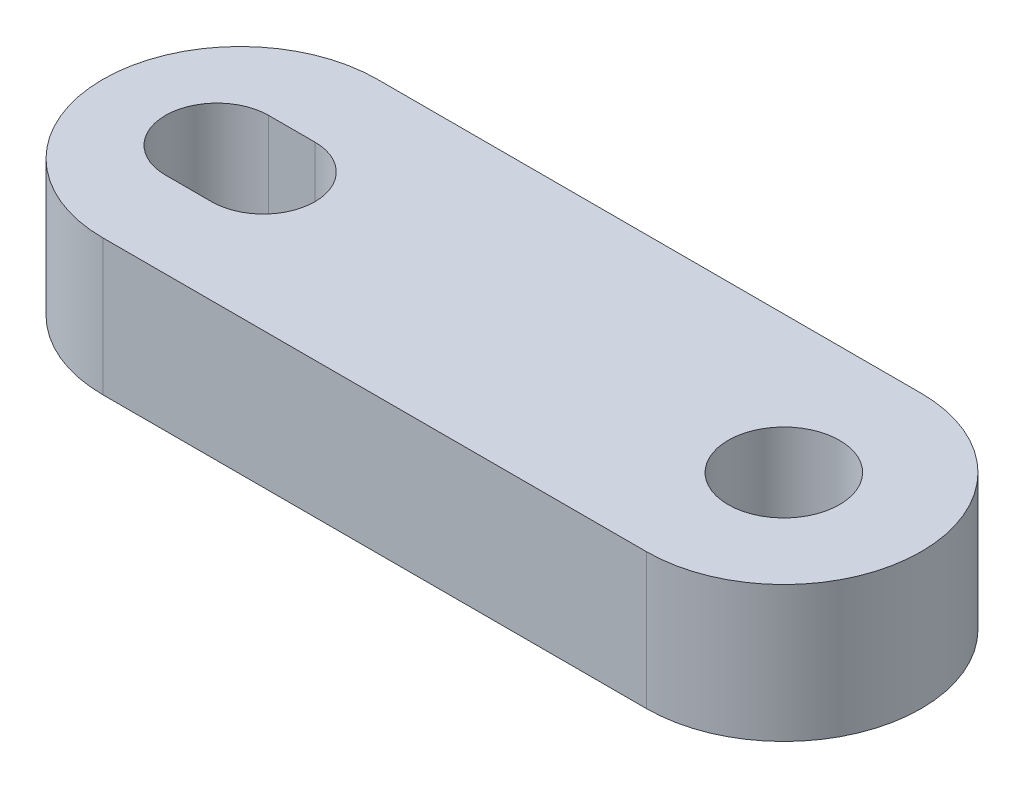
ISO-10303-21;
HEADER;
FILE_DESCRIPTION(('STEP AP214'),'2;1');
FILE_NAME('part.step','',(''),(''),'','','');
FILE_SCHEMA(('AUTOMOTIVE_DESIGN { 1 0 10303 214 1 1 1 1 }'));
ENDSEC;
DATA;
#1=APPLICATION_CONTEXT('core data for automotive mechanical design processes');
#2=APPLICATION_PROTOCOL_DEFINITION('international standard','automotive_design',2000,#1);
#3=PRODUCT_CONTEXT('',#1,'mechanical');
#4=PRODUCT('Part','Part','',(#3));
#5=PRODUCT_RELATED_PRODUCT_CATEGORY('part','',(#4));
#6=PRODUCT_DEFINITION_FORMATION('','',#4);
#7=PRODUCT_DEFINITION_CONTEXT('part definition',#1,'design');
#8=PRODUCT_DEFINITION('design','',#6,#7);
#9=PRODUCT_DEFINITION_SHAPE('','',#8);
#10=(LENGTH_UNIT() NAMED_UNIT(*) SI_UNIT(.MILLI.,.METRE.));
#11=(NAMED_UNIT(*) PLANE_ANGLE_UNIT() SI_UNIT($,.RADIAN.));
#12=(NAMED_UNIT(*) SI_UNIT($,.STERADIAN.) SOLID_ANGLE_UNIT());
#13=UNCERTAINTY_MEASURE_WITH_UNIT(LENGTH_MEASURE(1.E-05),#10,'distance_accuracy_value','');
#14=(GEOMETRIC_REPRESENTATION_CONTEXT(3) GLOBAL_UNCERTAINTY_ASSIGNED_CONTEXT((#13)) GLOBAL_UNIT_ASSIGNED_CONTEXT((#10,
#11,#12)) REPRESENTATION_CONTEXT('',''));
#15=CARTESIAN_POINT('',(0.,0.,0.));
#16=DIRECTION('',(0.,0.,1.));
#17=DIRECTION('',(1.,0.,0.));
#18=AXIS2_PLACEMENT_3D('',#15,#16,#17);
#19=CARTESIAN_POINT('',(-10.,5.,0.));
#20=DIRECTION('',(0.,1.,0.));
#21=DIRECTION('',(0.,0.,1.));
#22=AXIS2_PLACEMENT_3D('',#19,#20,#21);
#23=PLANE('',#22);
#24=CARTESIAN_POINT('',(-10.,5.,0.));
#25=DIRECTION('',(0.,1.,0.));
#26=DIRECTION('',(0.,0.,1.));
#27=AXIS2_PLACEMENT_3D('',#24,#25,#26);
#28=CIRCLE('',#27,5.05);
#29=CARTESIAN_POINT('',(-10.,5.,-5.05));
#30=VERTEX_POINT('',#29);
#31=CARTESIAN_POINT('',(-10.,5.,5.05));
#32=VERTEX_POINT('',#31);
#33=EDGE_CURVE('E139',#30,#32,#28,.T.);
#34=ORIENTED_EDGE('',*,*,#33,.T.);
#35=DIRECTION('',(1.,0.,0.));
#36=VECTOR('',#35,1.);
#37=CARTESIAN_POINT('',(-10.,5.,5.05));
#38=LINE('',#37,#36);
#39=CARTESIAN_POINT('',(10.,5.,5.05));
#40=VERTEX_POINT('',#39);
#41=EDGE_CURVE('E142',#32,#40,#38,.T.);
#42=ORIENTED_EDGE('',*,*,#41,.T.);
#43=CARTESIAN_POINT('',(10.,5.,0.));
#44=DIRECTION('',(0.,1.,0.));
#45=DIRECTION('',(0.,0.,1.));
#46=AXIS2_PLACEMENT_3D('',#43,#44,#45);
#47=CIRCLE('',#46,5.05);
#48=CARTESIAN_POINT('',(10.,5.,-5.05000000000001));
#49=VERTEX_POINT('',#48);
#50=EDGE_CURVE('E145',#40,#49,#47,.T.);
#51=ORIENTED_EDGE('',*,*,#50,.T.);
#52=DIRECTION('',(-1.,0.,0.));
#53=VECTOR('',#52,1.);
#54=CARTESIAN_POINT('',(-10.,5.,-5.05));
#55=LINE('',#54,#53);
#56=EDGE_CURVE('E147',#49,#30,#55,.T.);
#57=ORIENTED_EDGE('',*,*,#56,.T.);
#58=EDGE_LOOP('',(#34,#42,#51,#57));
#59=FACE_BOUND('',#58,.T.);
#60=CARTESIAN_POINT('',(10.,5.,0.));
#61=DIRECTION('',(0.,1.,0.));
#62=DIRECTION('',(0.,0.,1.));
#63=AXIS2_PLACEMENT_3D('',#60,#61,#62);
#64=CIRCLE('',#63,2.05);
#65=CARTESIAN_POINT('',(10.,5.,2.05));
#66=VERTEX_POINT('',#65);
#67=EDGE_CURVE('E133',#66,#66,#64,.T.);
#68=ORIENTED_EDGE('',*,*,#67,.F.);
#69=EDGE_LOOP('',(#68));
#70=FACE_BOUND('',#69,.T.);
#71=DIRECTION('',(1.,0.,0.));
#72=VECTOR('',#71,1.);
#73=CARTESIAN_POINT('',(-10.85,5.,1.9));
#74=LINE('',#73,#72);
#75=CARTESIAN_POINT('',(-10.85,5.,1.9));
#76=VERTEX_POINT('',#75);
#77=CARTESIAN_POINT('',(-9.15,5.,1.9));
#78=VERTEX_POINT('',#77);
#79=EDGE_CURVE('E105',#76,#78,#74,.T.);
#80=ORIENTED_EDGE('',*,*,#79,.F.);
#81=CARTESIAN_POINT('',(-10.85,5.,0.));
#82=DIRECTION('',(0.,1.,0.));
#83=DIRECTION('',(0.,0.,1.));
#84=AXIS2_PLACEMENT_3D('',#81,#82,#83);
#85=CIRCLE('',#84,1.9);
#86=CARTESIAN_POINT('',(-10.85,5.,-1.9));
#87=VERTEX_POINT('',#86);
#88=EDGE_CURVE('E97',#87,#76,#85,.T.);
#89=ORIENTED_EDGE('',*,*,#88,.F.);
#90=DIRECTION('',(-1.,0.,0.));
#91=VECTOR('',#90,1.);
#92=CARTESIAN_POINT('',(-10.85,5.,-1.9));
#93=LINE('',#92,#91);
#94=CARTESIAN_POINT('',(-9.15,5.,-1.9));
#95=VERTEX_POINT('',#94);
#96=EDGE_CURVE('E119',#95,#87,#93,.T.);
#97=ORIENTED_EDGE('',*,*,#96,.F.);
#98=CARTESIAN_POINT('',(-9.15,5.,0.));
#99=DIRECTION('',(0.,1.,0.));
#100=DIRECTION('',(0.,0.,1.));
#101=AXIS2_PLACEMENT_3D('',#98,#99,#100);
#102=CIRCLE('',#101,1.9);
#103=EDGE_CURVE('E117',#78,#95,#102,.T.);
#104=ORIENTED_EDGE('',*,*,#103,.F.);
#105=EDGE_LOOP('',(#80,#89,#97,#104));
#106=FACE_BOUND('',#105,.T.);
#107=ADVANCED_FACE('F32',(#59,#70,#106),#23,.T.);
#108=CARTESIAN_POINT('',(-10.,0.,0.));
#109=DIRECTION('',(0.,1.,0.));
#110=DIRECTION('',(0.,0.,1.));
#111=AXIS2_PLACEMENT_3D('',#108,#109,#110);
#112=PLANE('',#111);
#113=CARTESIAN_POINT('',(10.,0.,0.));
#114=DIRECTION('',(0.,1.,0.));
#115=DIRECTION('',(0.,0.,1.));
#116=AXIS2_PLACEMENT_3D('',#113,#114,#115);
#117=CIRCLE('',#116,2.05);
#118=CARTESIAN_POINT('',(10.,0.,2.05));
#119=VERTEX_POINT('',#118);
#120=EDGE_CURVE('E113',#119,#119,#117,.T.);
#121=ORIENTED_EDGE('',*,*,#120,.T.);
#122=EDGE_LOOP('',(#121));
#123=FACE_BOUND('',#122,.T.);
#124=CARTESIAN_POINT('',(-10.,0.,0.));
#125=DIRECTION('',(0.,1.,0.));
#126=DIRECTION('',(0.,0.,1.));
#127=AXIS2_PLACEMENT_3D('',#124,#125,#126);
#128=CIRCLE('',#127,5.05);
#129=CARTESIAN_POINT('',(-10.,0.,-5.05));
#130=VERTEX_POINT('',#129);
#131=CARTESIAN_POINT('',(-10.,0.,5.05));
#132=VERTEX_POINT('',#131);
#133=EDGE_CURVE('E136',#130,#132,#128,.T.);
#134=ORIENTED_EDGE('',*,*,#133,.F.);
#135=DIRECTION('',(-1.,0.,0.));
#136=VECTOR('',#135,1.);
#137=CARTESIAN_POINT('',(-10.,0.,-5.05));
#138=LINE('',#137,#136);
#139=CARTESIAN_POINT('',(10.,0.,-5.05000000000001));
#140=VERTEX_POINT('',#139);
#141=EDGE_CURVE('E143',#140,#130,#138,.T.);
#142=ORIENTED_EDGE('',*,*,#141,.F.);
#143=CARTESIAN_POINT('',(10.,0.,0.));
#144=DIRECTION('',(0.,1.,0.));
#145=DIRECTION('',(0.,0.,1.));
#146=AXIS2_PLACEMENT_3D('',#143,#144,#145);
#147=CIRCLE('',#146,5.05);
#148=CARTESIAN_POINT('',(10.,0.,5.05));
#149=VERTEX_POINT('',#148);
#150=EDGE_CURVE('E154',#149,#140,#147,.T.);
#151=ORIENTED_EDGE('',*,*,#150,.F.);
#152=DIRECTION('',(1.,0.,0.));
#153=VECTOR('',#152,1.);
#154=CARTESIAN_POINT('',(-10.,0.,5.05));
#155=LINE('',#154,#153);
#156=EDGE_CURVE('E152',#132,#149,#155,.T.);
#157=ORIENTED_EDGE('',*,*,#156,.F.);
#158=EDGE_LOOP('',(#134,#142,#151,#157));
#159=FACE_BOUND('',#158,.T.);
#160=CARTESIAN_POINT('',(-10.85,0.,0.));
#161=DIRECTION('',(0.,1.,0.));
#162=DIRECTION('',(0.,0.,1.));
#163=AXIS2_PLACEMENT_3D('',#160,#161,#162);
#164=CIRCLE('',#163,1.9);
#165=CARTESIAN_POINT('',(-10.85,0.,-1.9));
#166=VERTEX_POINT('',#165);
#167=CARTESIAN_POINT('',(-10.85,0.,1.9));
#168=VERTEX_POINT('',#167);
#169=EDGE_CURVE('E55',#166,#168,#164,.T.);
#170=ORIENTED_EDGE('',*,*,#169,.T.);
#171=DIRECTION('',(1.,0.,0.));
#172=VECTOR('',#171,1.);
#173=CARTESIAN_POINT('',(-10.85,0.,1.9));
#174=LINE('',#173,#172);
#175=CARTESIAN_POINT('',(-9.15,0.,1.9));
#176=VERTEX_POINT('',#175);
#177=EDGE_CURVE('E112',#168,#176,#174,.T.);
#178=ORIENTED_EDGE('',*,*,#177,.T.);
#179=CARTESIAN_POINT('',(-9.15,0.,0.));
#180=DIRECTION('',(0.,1.,0.));
#181=DIRECTION('',(0.,0.,1.));
#182=AXIS2_PLACEMENT_3D('',#179,#180,#181);
#183=CIRCLE('',#182,1.9);
#184=CARTESIAN_POINT('',(-9.15,0.,-1.9));
#185=VERTEX_POINT('',#184);
#186=EDGE_CURVE('E125',#176,#185,#183,.T.);
#187=ORIENTED_EDGE('',*,*,#186,.T.);
#188=DIRECTION('',(-1.,0.,0.));
#189=VECTOR('',#188,1.);
#190=CARTESIAN_POINT('',(-10.85,0.,-1.9));
#191=LINE('',#190,#189);
#192=EDGE_CURVE('E106',#185,#166,#191,.T.);
#193=ORIENTED_EDGE('',*,*,#192,.T.);
#194=EDGE_LOOP('',(#170,#178,#187,#193));
#195=FACE_BOUND('',#194,.T.);
#196=ADVANCED_FACE('F172',(#123,#159,#195),#112,.F.);
#197=CARTESIAN_POINT('',(-10.,5.,0.));
#198=DIRECTION('',(0.,-1.,0.));
#199=DIRECTION('',(0.,0.,-1.));
#200=AXIS2_PLACEMENT_3D('',#197,#198,#199);
#201=CYLINDRICAL_SURFACE('',#200,5.05);
#202=ORIENTED_EDGE('',*,*,#133,.T.);
#203=DIRECTION('',(0.,-1.,0.));
#204=VECTOR('',#203,1.);
#205=CARTESIAN_POINT('',(-10.,5.,5.05));
#206=LINE('',#205,#204);
#207=EDGE_CURVE('E11',#32,#132,#206,.T.);
#208=ORIENTED_EDGE('',*,*,#207,.F.);
#209=ORIENTED_EDGE('',*,*,#33,.F.);
#210=DIRECTION('',(0.,-1.,0.));
#211=VECTOR('',#210,1.);
#212=CARTESIAN_POINT('',(-10.,5.,-5.05));
#213=LINE('',#212,#211);
#214=EDGE_CURVE('E149',#30,#130,#213,.T.);
#215=ORIENTED_EDGE('',*,*,#214,.T.);
#216=EDGE_LOOP('',(#202,#208,#209,#215));
#217=FACE_BOUND('',#216,.T.);
#218=ADVANCED_FACE('F34',(#217),#201,.T.);
#219=CARTESIAN_POINT('',(-10.,5.,5.05));
#220=DIRECTION('',(0.,0.,-1.));
#221=DIRECTION('',(-1.,0.,0.));
#222=AXIS2_PLACEMENT_3D('',#219,#220,#221);
#223=PLANE('',#222);
#224=ORIENTED_EDGE('',*,*,#156,.T.);
#225=DIRECTION('',(0.,-1.,0.));
#226=VECTOR('',#225,1.);
#227=CARTESIAN_POINT('',(10.,5.,5.05));
#228=LINE('',#227,#226);
#229=EDGE_CURVE('E40',#40,#149,#228,.T.);
#230=ORIENTED_EDGE('',*,*,#229,.F.);
#231=ORIENTED_EDGE('',*,*,#41,.F.);
#232=ORIENTED_EDGE('',*,*,#207,.T.);
#233=EDGE_LOOP('',(#224,#230,#231,#232));
#234=FACE_BOUND('',#233,.T.);
#235=ADVANCED_FACE('F183',(#234),#223,.F.);
#236=CARTESIAN_POINT('',(10.,5.,0.));
#237=DIRECTION('',(0.,-1.,0.));
#238=DIRECTION('',(0.,0.,-1.));
#239=AXIS2_PLACEMENT_3D('',#236,#237,#238);
#240=CYLINDRICAL_SURFACE('',#239,5.05);
#241=ORIENTED_EDGE('',*,*,#150,.T.);
#242=DIRECTION('',(0.,-1.,0.));
#243=VECTOR('',#242,1.);
#244=CARTESIAN_POINT('',(10.,5.,-5.05000000000001));
#245=LINE('',#244,#243);
#246=EDGE_CURVE('E159',#49,#140,#245,.T.);
#247=ORIENTED_EDGE('',*,*,#246,.F.);
#248=ORIENTED_EDGE('',*,*,#50,.F.);
#249=ORIENTED_EDGE('',*,*,#229,.T.);
#250=EDGE_LOOP('',(#241,#247,#248,#249));
#251=FACE_BOUND('',#250,.T.);
#252=ADVANCED_FACE('F166',(#251),#240,.T.);
#253=CARTESIAN_POINT('',(-10.,5.,-5.05));
#254=DIRECTION('',(0.,0.,1.));
#255=DIRECTION('',(1.,0.,0.));
#256=AXIS2_PLACEMENT_3D('',#253,#254,#255);
#257=PLANE('',#256);
#258=ORIENTED_EDGE('',*,*,#141,.T.);
#259=ORIENTED_EDGE('',*,*,#214,.F.);
#260=ORIENTED_EDGE('',*,*,#56,.F.);
#261=ORIENTED_EDGE('',*,*,#246,.T.);
#262=EDGE_LOOP('',(#258,#259,#260,#261));
#263=FACE_BOUND('',#262,.T.);
#264=ADVANCED_FACE('F176',(#263),#257,.F.);
#265=CARTESIAN_POINT('',(10.,5.,0.));
#266=DIRECTION('',(0.,-1.,0.));
#267=DIRECTION('',(0.,0.,-1.));
#268=AXIS2_PLACEMENT_3D('',#265,#266,#267);
#269=CYLINDRICAL_SURFACE('',#268,2.05);
#270=ORIENTED_EDGE('',*,*,#67,.T.);
#271=EDGE_LOOP('',(#270));
#272=FACE_BOUND('',#271,.T.);
#273=ORIENTED_EDGE('',*,*,#120,.F.);
#274=EDGE_LOOP('',(#273));
#275=FACE_BOUND('',#274,.T.);
#276=ADVANCED_FACE('F198',(#272,#275),#269,.F.);
#277=CARTESIAN_POINT('',(-10.85,5.,0.));
#278=DIRECTION('',(0.,-1.,0.));
#279=DIRECTION('',(0.,0.,-1.));
#280=AXIS2_PLACEMENT_3D('',#277,#278,#279);
#281=CYLINDRICAL_SURFACE('',#280,1.9);
#282=ORIENTED_EDGE('',*,*,#169,.F.);
#283=DIRECTION('',(0.,-1.,0.));
#284=VECTOR('',#283,1.);
#285=CARTESIAN_POINT('',(-10.85,5.,-1.9));
#286=LINE('',#285,#284);
#287=EDGE_CURVE('E101',#87,#166,#286,.T.);
#288=ORIENTED_EDGE('',*,*,#287,.F.);
#289=ORIENTED_EDGE('',*,*,#88,.T.);
#290=DIRECTION('',(0.,-1.,0.));
#291=VECTOR('',#290,1.);
#292=CARTESIAN_POINT('',(-10.85,5.,1.9));
#293=LINE('',#292,#291);
#294=EDGE_CURVE('E100',#76,#168,#293,.T.);
#295=ORIENTED_EDGE('',*,*,#294,.T.);
#296=EDGE_LOOP('',(#282,#288,#289,#295));
#297=FACE_BOUND('',#296,.T.);
#298=ADVANCED_FACE('F99',(#297),#281,.F.);
#299=CARTESIAN_POINT('',(-10.85,5.,1.9));
#300=DIRECTION('',(0.,0.,-1.));
#301=DIRECTION('',(-1.,0.,0.));
#302=AXIS2_PLACEMENT_3D('',#299,#300,#301);
#303=PLANE('',#302);
#304=ORIENTED_EDGE('',*,*,#177,.F.);
#305=ORIENTED_EDGE('',*,*,#294,.F.);
#306=ORIENTED_EDGE('',*,*,#79,.T.);
#307=DIRECTION('',(0.,-1.,0.));
#308=VECTOR('',#307,1.);
#309=CARTESIAN_POINT('',(-9.15,5.,1.9));
#310=LINE('',#309,#308);
#311=EDGE_CURVE('E114',#78,#176,#310,.T.);
#312=ORIENTED_EDGE('',*,*,#311,.T.);
#313=EDGE_LOOP('',(#304,#305,#306,#312));
#314=FACE_BOUND('',#313,.T.);
#315=ADVANCED_FACE('F109',(#314),#303,.T.);
#316=CARTESIAN_POINT('',(-9.15,5.,0.));
#317=DIRECTION('',(0.,-1.,0.));
#318=DIRECTION('',(0.,0.,-1.));
#319=AXIS2_PLACEMENT_3D('',#316,#317,#318);
#320=CYLINDRICAL_SURFACE('',#319,1.9);
#321=ORIENTED_EDGE('',*,*,#186,.F.);
#322=ORIENTED_EDGE('',*,*,#311,.F.);
#323=ORIENTED_EDGE('',*,*,#103,.T.);
#324=DIRECTION('',(0.,-1.,0.));
#325=VECTOR('',#324,1.);
#326=CARTESIAN_POINT('',(-9.15,5.,-1.9));
#327=LINE('',#326,#325);
#328=EDGE_CURVE('E47',#95,#185,#327,.T.);
#329=ORIENTED_EDGE('',*,*,#328,.T.);
#330=EDGE_LOOP('',(#321,#322,#323,#329));
#331=FACE_BOUND('',#330,.T.);
#332=ADVANCED_FACE('F215',(#331),#320,.F.);
#333=CARTESIAN_POINT('',(-10.85,5.,-1.9));
#334=DIRECTION('',(0.,0.,1.));
#335=DIRECTION('',(1.,0.,0.));
#336=AXIS2_PLACEMENT_3D('',#333,#334,#335);
#337=PLANE('',#336);
#338=ORIENTED_EDGE('',*,*,#192,.F.);
#339=ORIENTED_EDGE('',*,*,#328,.F.);
#340=ORIENTED_EDGE('',*,*,#96,.T.);
#341=ORIENTED_EDGE('',*,*,#287,.T.);
#342=EDGE_LOOP('',(#338,#339,#340,#341));
#343=FACE_BOUND('',#342,.T.);
#344=ADVANCED_FACE('F220',(#343),#337,.T.);
#345=CLOSED_SHELL('',(#107,#196,#218,#235,#252,#264,#276,#298,#315,#332,#344));
#346=MANIFOLD_SOLID_BREP('B2',#345);
#347=ADVANCED_BREP_SHAPE_REPRESENTATION('',(#18,#346),#14);
#348=SHAPE_DEFINITION_REPRESENTATION(#9,#347);
ENDSEC;
END-ISO-10303-21;
